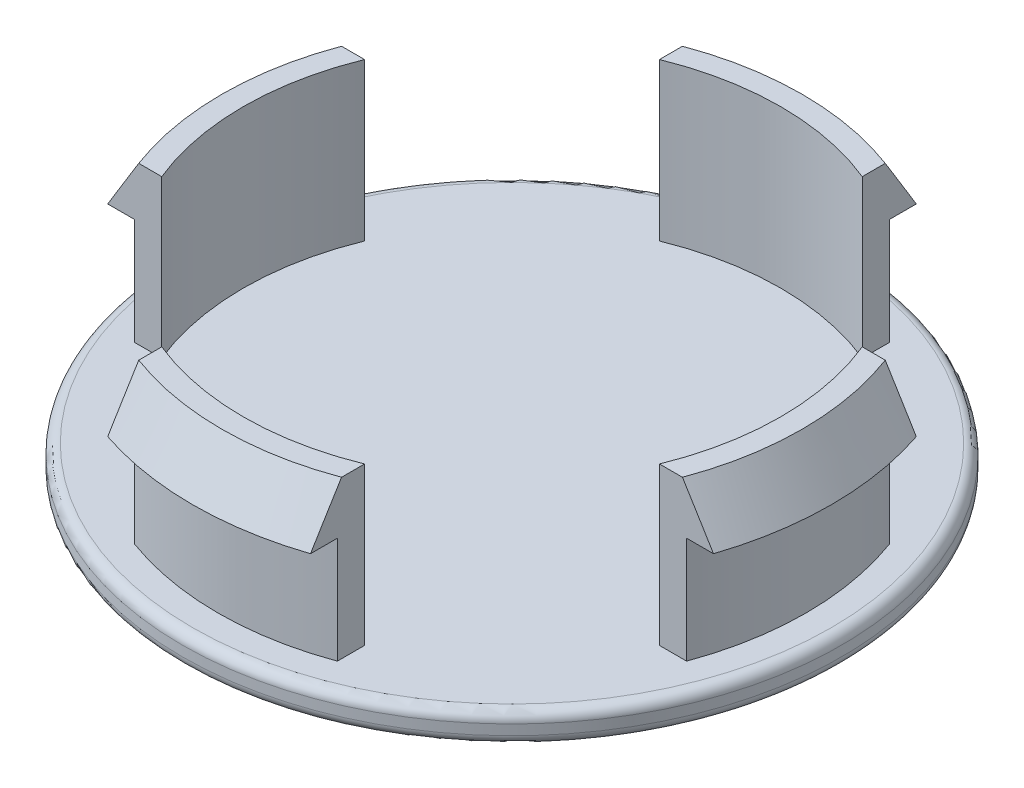
ISO-10303-21;
HEADER;
FILE_DESCRIPTION(('STEP AP214'),'2;1');
FILE_NAME('part.step','',(''),(''),'','','');
FILE_SCHEMA(('AUTOMOTIVE_DESIGN { 1 0 10303 214 1 1 1 1 }'));
ENDSEC;
DATA;
#1=APPLICATION_CONTEXT('core data for automotive mechanical design processes');
#2=APPLICATION_PROTOCOL_DEFINITION('international standard','automotive_design',2000,#1);
#3=PRODUCT_CONTEXT('',#1,'mechanical');
#4=PRODUCT('Part','Part','',(#3));
#5=PRODUCT_RELATED_PRODUCT_CATEGORY('part','',(#4));
#6=PRODUCT_DEFINITION_FORMATION('','',#4);
#7=PRODUCT_DEFINITION_CONTEXT('part definition',#1,'design');
#8=PRODUCT_DEFINITION('design','',#6,#7);
#9=PRODUCT_DEFINITION_SHAPE('','',#8);
#10=(LENGTH_UNIT() NAMED_UNIT(*) SI_UNIT(.MILLI.,.METRE.));
#11=(NAMED_UNIT(*) PLANE_ANGLE_UNIT() SI_UNIT($,.RADIAN.));
#12=(NAMED_UNIT(*) SI_UNIT($,.STERADIAN.) SOLID_ANGLE_UNIT());
#13=UNCERTAINTY_MEASURE_WITH_UNIT(LENGTH_MEASURE(1.E-05),#10,'distance_accuracy_value','');
#14=(GEOMETRIC_REPRESENTATION_CONTEXT(3) GLOBAL_UNCERTAINTY_ASSIGNED_CONTEXT((#13)) GLOBAL_UNIT_ASSIGNED_CONTEXT((#10,
#11,#12)) REPRESENTATION_CONTEXT('',''));
#15=CARTESIAN_POINT('',(0.,0.,0.));
#16=DIRECTION('',(0.,0.,1.));
#17=DIRECTION('',(1.,0.,0.));
#18=AXIS2_PLACEMENT_3D('',#15,#16,#17);
#19=CARTESIAN_POINT('',(0.,0.,0.));
#20=DIRECTION('',(0.,1.,0.));
#21=DIRECTION('',(0.,0.,1.));
#22=AXIS2_PLACEMENT_3D('',#19,#20,#21);
#23=CYLINDRICAL_SURFACE('',#22,26.5);
#24=CARTESIAN_POINT('',(0.,18.5,0.));
#25=DIRECTION('',(0.,1.,0.));
#26=DIRECTION('',(0.,0.,1.));
#27=AXIS2_PLACEMENT_3D('',#24,#25,#26);
#28=CIRCLE('',#27,26.5);
#29=CARTESIAN_POINT('',(10.,18.5,-24.5407823836161));
#30=VERTEX_POINT('',#29);
#31=CARTESIAN_POINT('',(-10.,18.5,-24.5407823836161));
#32=VERTEX_POINT('',#31);
#33=EDGE_CURVE('E216',#30,#32,#28,.T.);
#34=ORIENTED_EDGE('',*,*,#33,.T.);
#35=DIRECTION('',(0.,1.,0.));
#36=VECTOR('',#35,1.);
#37=CARTESIAN_POINT('',(-10.,-40.6378852958112,-24.5407823836161));
#38=LINE('',#37,#36);
#39=CARTESIAN_POINT('',(-10.,3.,-24.5407823836161));
#40=VERTEX_POINT('',#39);
#41=EDGE_CURVE('E210',#40,#32,#38,.T.);
#42=ORIENTED_EDGE('',*,*,#41,.F.);
#43=CARTESIAN_POINT('',(0.,3.,0.));
#44=DIRECTION('',(0.,1.,0.));
#45=DIRECTION('',(0.,0.,1.));
#46=AXIS2_PLACEMENT_3D('',#43,#44,#45);
#47=CIRCLE('',#46,26.5);
#48=CARTESIAN_POINT('',(10.,3.,-24.5407823836161));
#49=VERTEX_POINT('',#48);
#50=EDGE_CURVE('E11',#49,#40,#47,.T.);
#51=ORIENTED_EDGE('',*,*,#50,.F.);
#52=DIRECTION('',(0.,1.,0.));
#53=VECTOR('',#52,1.);
#54=CARTESIAN_POINT('',(10.,-40.6378852958112,-24.5407823836161));
#55=LINE('',#54,#53);
#56=EDGE_CURVE('E421',#49,#30,#55,.T.);
#57=ORIENTED_EDGE('',*,*,#56,.T.);
#58=EDGE_LOOP('',(#34,#42,#51,#57));
#59=FACE_BOUND('',#58,.T.);
#60=ADVANCED_FACE('F35',(#59),#23,.F.);
#61=CARTESIAN_POINT('',(-28.6132486540518,18.5,0.));
#62=DIRECTION('',(0.,1.,0.));
#63=DIRECTION('',(0.,0.,1.));
#64=AXIS2_PLACEMENT_3D('',#61,#62,#63);
#65=PLANE('',#64);
#66=CARTESIAN_POINT('',(0.,18.5,0.));
#67=DIRECTION('',(0.,1.,0.));
#68=DIRECTION('',(0.,0.,1.));
#69=AXIS2_PLACEMENT_3D('',#66,#67,#68);
#70=CIRCLE('',#69,28.6132486540518);
#71=CARTESIAN_POINT('',(10.,18.5,-26.8089163999331));
#72=VERTEX_POINT('',#71);
#73=CARTESIAN_POINT('',(-10.,18.5,-26.8089163999331));
#74=VERTEX_POINT('',#73);
#75=EDGE_CURVE('E221',#72,#74,#70,.T.);
#76=ORIENTED_EDGE('',*,*,#75,.T.);
#77=DIRECTION('',(0.,0.,1.));
#78=VECTOR('',#77,1.);
#79=CARTESIAN_POINT('',(-9.99999999999999,18.5,0.));
#80=LINE('',#79,#78);
#81=EDGE_CURVE('E202',#74,#32,#80,.T.);
#82=ORIENTED_EDGE('',*,*,#81,.T.);
#83=ORIENTED_EDGE('',*,*,#33,.F.);
#84=DIRECTION('',(0.,0.,1.));
#85=VECTOR('',#84,1.);
#86=CARTESIAN_POINT('',(9.99999999999999,18.5,0.));
#87=LINE('',#86,#85);
#88=EDGE_CURVE('E419',#72,#30,#87,.T.);
#89=ORIENTED_EDGE('',*,*,#88,.F.);
#90=EDGE_LOOP('',(#76,#82,#83,#89));
#91=FACE_BOUND('',#90,.T.);
#92=ADVANCED_FACE('F319',(#91),#65,.T.);
#93=CARTESIAN_POINT('',(0.,18.5,0.));
#94=DIRECTION('',(0.,-1.,0.));
#95=DIRECTION('',(0.,0.,-1.));
#96=AXIS2_PLACEMENT_3D('',#93,#94,#95);
#97=CONICAL_SURFACE('',#96,28.6132486540518,0.523598775598303);
#98=CARTESIAN_POINT('',(0.,13.5,0.));
#99=DIRECTION('',(0.,1.,0.));
#100=DIRECTION('',(0.,0.,1.));
#101=AXIS2_PLACEMENT_3D('',#98,#99,#100);
#102=CIRCLE('',#101,31.5);
#103=CARTESIAN_POINT('',(9.99999999999999,13.5,-29.8705540624877));
#104=VERTEX_POINT('',#103);
#105=CARTESIAN_POINT('',(-10.,13.5,-29.8705540624877));
#106=VERTEX_POINT('',#105);
#107=EDGE_CURVE('E226',#104,#106,#102,.T.);
#108=ORIENTED_EDGE('',*,*,#107,.T.);
#109=CARTESIAN_POINT('',(-10.,0.0380337176999262,-37.9777721794444));
#110=CARTESIAN_POINT('',(-10.,1.21069904858379,-37.2776349244702));
#111=CARTESIAN_POINT('',(-10.,2.38283064665295,-36.5766018971294));
#112=CARTESIAN_POINT('',(-10.,4.72577921730675,-35.1723414017115));
#113=CARTESIAN_POINT('',(-10.,5.89659618923228,-34.4691139325349));
#114=CARTESIAN_POINT('',(-10.,8.23660645610638,-33.060098917814));
#115=CARTESIAN_POINT('',(-10.,9.40579983215849,-32.3543115070117));
#116=CARTESIAN_POINT('',(-10.,11.7422864300774,-30.9395986679945));
#117=CARTESIAN_POINT('',(-10.,12.9095796530463,-30.2306732416007));
#118=CARTESIAN_POINT('',(-10.,15.2418796152031,-28.8089553369));
#119=CARTESIAN_POINT('',(-10.,16.4068862522619,-28.0961626909877));
#120=CARTESIAN_POINT('',(-10.,18.7339730871932,-26.6658236976814));
#121=CARTESIAN_POINT('',(-10.,19.8960532991588,-25.9482773732411));
#122=CARTESIAN_POINT('',(-10.,21.6364000776036,-24.8674228954663));
#123=CARTESIAN_POINT('',(-10.,22.2160690395561,-24.506372420491));
#124=CARTESIAN_POINT('',(-10.,23.3743364527512,-23.7825593471345));
#125=CARTESIAN_POINT('',(-10.,23.9529349052358,-23.4197967507415));
#126=CARTESIAN_POINT('',(-10.,25.1089173541076,-22.6923200552483));
#127=CARTESIAN_POINT('',(-10.,25.6863013307351,-22.3276059247333));
#128=CARTESIAN_POINT('',(-10.,26.8396479877336,-21.5959325867297));
#129=CARTESIAN_POINT('',(-10.,27.415610662407,-21.2289733702614));
#130=CARTESIAN_POINT('',(-10.,27.990761639856,-20.8607433765375));
#131=B_SPLINE_CURVE_WITH_KNOTS('',3,(#109,#110,#111,#112,#113,#114,#115,#116,#117,#118,#119,
#120,#121,#122,#123,#124,#125,#126,#127,#128,#129,#130),.UNSPECIFIED.,.F.,.F.,(4,2,2,2,2,2,2,2,
2,2,4),(0.,4.09732029107365,8.19464263543743,12.2917523603476,16.3888597080831,20.4861460661349,
24.5834126543644,26.6321566694296,28.6808983060587,30.7296730221881,32.7784559382096),.UNSPECIFIED.);
#132=EDGE_CURVE('E507',#106,#74,#131,.T.);
#133=ORIENTED_EDGE('',*,*,#132,.T.);
#134=ORIENTED_EDGE('',*,*,#75,.F.);
#135=CARTESIAN_POINT('',(10.,0.0380337176999262,-37.9777721794444));
#136=CARTESIAN_POINT('',(10.,1.21069904858379,-37.2776349244702));
#137=CARTESIAN_POINT('',(10.,2.38283064665295,-36.5766018971294));
#138=CARTESIAN_POINT('',(10.,4.72577921730675,-35.1723414017115));
#139=CARTESIAN_POINT('',(10.,5.89659618923228,-34.4691139325349));
#140=CARTESIAN_POINT('',(10.,8.23660645610638,-33.060098917814));
#141=CARTESIAN_POINT('',(10.,9.40579983215849,-32.3543115070117));
#142=CARTESIAN_POINT('',(10.,11.7422864300774,-30.9395986679945));
#143=CARTESIAN_POINT('',(10.,12.9095796530463,-30.2306732416007));
#144=CARTESIAN_POINT('',(10.,15.2418796152031,-28.8089553369));
#145=CARTESIAN_POINT('',(10.,16.4068862522619,-28.0961626909877));
#146=CARTESIAN_POINT('',(10.,18.7339730871932,-26.6658236976814));
#147=CARTESIAN_POINT('',(10.,19.8960532991588,-25.9482773732411));
#148=CARTESIAN_POINT('',(10.,21.6364000776036,-24.8674228954663));
#149=CARTESIAN_POINT('',(10.,22.2160690395561,-24.506372420491));
#150=CARTESIAN_POINT('',(10.,23.3743364527512,-23.7825593471345));
#151=CARTESIAN_POINT('',(10.,23.9529349052358,-23.4197967507415));
#152=CARTESIAN_POINT('',(10.,25.1089173541076,-22.6923200552483));
#153=CARTESIAN_POINT('',(10.,25.6863013307351,-22.3276059247333));
#154=CARTESIAN_POINT('',(10.,26.8396479877336,-21.5959325867297));
#155=CARTESIAN_POINT('',(10.,27.415610662407,-21.2289733702614));
#156=CARTESIAN_POINT('',(10.,27.990761639856,-20.8607433765375));
#157=B_SPLINE_CURVE_WITH_KNOTS('',3,(#135,#136,#137,#138,#139,#140,#141,#142,#143,#144,#145,
#146,#147,#148,#149,#150,#151,#152,#153,#154,#155,#156),.UNSPECIFIED.,.F.,.F.,(4,2,2,2,2,2,2,2,
2,2,4),(0.,4.09732029107365,8.19464263543743,12.2917523603476,16.3888597080831,20.4861460661349,
24.5834126543644,26.6321566694296,28.6808983060587,30.7296730221881,32.7784559382096),.UNSPECIFIED.);
#158=EDGE_CURVE('E429',#104,#72,#157,.T.);
#159=ORIENTED_EDGE('',*,*,#158,.F.);
#160=EDGE_LOOP('',(#108,#133,#134,#159));
#161=FACE_BOUND('',#160,.T.);
#162=ADVANCED_FACE('F310',(#161),#97,.T.);
#163=CARTESIAN_POINT('',(-29.,13.5,0.));
#164=DIRECTION('',(0.,-1.,0.));
#165=DIRECTION('',(0.,0.,-1.));
#166=AXIS2_PLACEMENT_3D('',#163,#164,#165);
#167=PLANE('',#166);
#168=CARTESIAN_POINT('',(0.,13.5,0.));
#169=DIRECTION('',(0.,1.,0.));
#170=DIRECTION('',(0.,0.,1.));
#171=AXIS2_PLACEMENT_3D('',#168,#169,#170);
#172=CIRCLE('',#171,29.);
#173=CARTESIAN_POINT('',(10.,13.5,-27.2213151776324));
#174=VERTEX_POINT('',#173);
#175=CARTESIAN_POINT('',(-10.,13.5,-27.2213151776324));
#176=VERTEX_POINT('',#175);
#177=EDGE_CURVE('E231',#174,#176,#172,.T.);
#178=ORIENTED_EDGE('',*,*,#177,.T.);
#179=DIRECTION('',(0.,0.,-1.));
#180=VECTOR('',#179,1.);
#181=CARTESIAN_POINT('',(-9.99999999999999,13.5,0.));
#182=LINE('',#181,#180);
#183=EDGE_CURVE('E514',#176,#106,#182,.T.);
#184=ORIENTED_EDGE('',*,*,#183,.T.);
#185=ORIENTED_EDGE('',*,*,#107,.F.);
#186=DIRECTION('',(0.,0.,-1.));
#187=VECTOR('',#186,1.);
#188=CARTESIAN_POINT('',(9.99999999999999,13.5,0.));
#189=LINE('',#188,#187);
#190=EDGE_CURVE('E427',#174,#104,#189,.T.);
#191=ORIENTED_EDGE('',*,*,#190,.F.);
#192=EDGE_LOOP('',(#178,#184,#185,#191));
#193=FACE_BOUND('',#192,.T.);
#194=ADVANCED_FACE('F303',(#193),#167,.T.);
#195=CARTESIAN_POINT('',(0.,0.,0.));
#196=DIRECTION('',(0.,1.,0.));
#197=DIRECTION('',(0.,0.,1.));
#198=AXIS2_PLACEMENT_3D('',#195,#196,#197);
#199=CYLINDRICAL_SURFACE('',#198,29.);
#200=CARTESIAN_POINT('',(0.,3.,0.));
#201=DIRECTION('',(0.,1.,0.));
#202=DIRECTION('',(0.,0.,1.));
#203=AXIS2_PLACEMENT_3D('',#200,#201,#202);
#204=CIRCLE('',#203,29.);
#205=CARTESIAN_POINT('',(10.,3.,-27.2213151776324));
#206=VERTEX_POINT('',#205);
#207=CARTESIAN_POINT('',(-10.,3.,-27.2213151776324));
#208=VERTEX_POINT('',#207);
#209=EDGE_CURVE('E236',#206,#208,#204,.T.);
#210=ORIENTED_EDGE('',*,*,#209,.T.);
#211=DIRECTION('',(0.,1.,0.));
#212=VECTOR('',#211,1.);
#213=CARTESIAN_POINT('',(-10.,0.,-27.2213151776324));
#214=LINE('',#213,#212);
#215=EDGE_CURVE('E542',#208,#176,#214,.T.);
#216=ORIENTED_EDGE('',*,*,#215,.T.);
#217=ORIENTED_EDGE('',*,*,#177,.F.);
#218=DIRECTION('',(0.,1.,0.));
#219=VECTOR('',#218,1.);
#220=CARTESIAN_POINT('',(10.,0.,-27.2213151776324));
#221=LINE('',#220,#219);
#222=EDGE_CURVE('E416',#206,#174,#221,.T.);
#223=ORIENTED_EDGE('',*,*,#222,.F.);
#224=EDGE_LOOP('',(#210,#216,#217,#223));
#225=FACE_BOUND('',#224,.T.);
#226=ADVANCED_FACE('F299',(#225),#199,.T.);
#227=DIRECTION('',(0.,1.,0.));
#228=VECTOR('',#227,1.);
#229=CARTESIAN_POINT('',(-24.5407823836161,-40.6378852958112,-9.99999999999999));
#230=LINE('',#229,#228);
#231=CARTESIAN_POINT('',(-24.5407823836161,3.,-9.99999999999999));
#232=VERTEX_POINT('',#231);
#233=CARTESIAN_POINT('',(-24.5407823836161,18.5,-9.99999999999999));
#234=VERTEX_POINT('',#233);
#235=EDGE_CURVE('E51',#232,#234,#230,.T.);
#236=ORIENTED_EDGE('',*,*,#235,.T.);
#237=CARTESIAN_POINT('',(-24.5407823836161,18.5,10.));
#238=VERTEX_POINT('',#237);
#239=EDGE_CURVE('E208',#234,#238,#28,.T.);
#240=ORIENTED_EDGE('',*,*,#239,.T.);
#241=DIRECTION('',(0.,1.,0.));
#242=VECTOR('',#241,1.);
#243=CARTESIAN_POINT('',(-24.5407823836161,-40.6378852958112,10.));
#244=LINE('',#243,#242);
#245=CARTESIAN_POINT('',(-24.5407823836161,3.,10.));
#246=VERTEX_POINT('',#245);
#247=EDGE_CURVE('E351',#246,#238,#244,.T.);
#248=ORIENTED_EDGE('',*,*,#247,.F.);
#249=EDGE_CURVE('E43',#232,#246,#47,.T.);
#250=ORIENTED_EDGE('',*,*,#249,.F.);
#251=EDGE_LOOP('',(#236,#240,#248,#250));
#252=FACE_BOUND('',#251,.T.);
#253=ADVANCED_FACE('F206',(#252),#23,.F.);
#254=DIRECTION('',(1.,0.,0.));
#255=VECTOR('',#254,1.);
#256=CARTESIAN_POINT('',(0.,18.5,-9.99999999999999));
#257=LINE('',#256,#255);
#258=CARTESIAN_POINT('',(-26.8089163999331,18.5,-9.99999999999999));
#259=VERTEX_POINT('',#258);
#260=EDGE_CURVE('E195',#259,#234,#257,.T.);
#261=ORIENTED_EDGE('',*,*,#260,.F.);
#262=CARTESIAN_POINT('',(-26.808916399933,18.5,10.));
#263=VERTEX_POINT('',#262);
#264=EDGE_CURVE('E224',#259,#263,#70,.T.);
#265=ORIENTED_EDGE('',*,*,#264,.T.);
#266=DIRECTION('',(1.,0.,0.));
#267=VECTOR('',#266,1.);
#268=CARTESIAN_POINT('',(0.,18.5,10.));
#269=LINE('',#268,#267);
#270=EDGE_CURVE('E215',#263,#238,#269,.T.);
#271=ORIENTED_EDGE('',*,*,#270,.T.);
#272=ORIENTED_EDGE('',*,*,#239,.F.);
#273=EDGE_LOOP('',(#261,#265,#271,#272));
#274=FACE_BOUND('',#273,.T.);
#275=ADVANCED_FACE('F213',(#274),#65,.T.);
#276=CARTESIAN_POINT('',(-37.9777721794444,0.0380337176999278,-9.99999999999999));
#277=CARTESIAN_POINT('',(-37.2776349244702,1.21069904858379,-9.99999999999999));
#278=CARTESIAN_POINT('',(-36.5766018971294,2.38283064665296,-9.99999999999999));
#279=CARTESIAN_POINT('',(-35.1723414017115,4.72577921730675,-9.99999999999999));
#280=CARTESIAN_POINT('',(-34.4691139325349,5.89659618923229,-9.99999999999999));
#281=CARTESIAN_POINT('',(-33.060098917814,8.23660645610639,-9.99999999999999));
#282=CARTESIAN_POINT('',(-32.3543115070117,9.4057998321585,-9.99999999999999));
#283=CARTESIAN_POINT('',(-30.9395986679945,11.7422864300774,-9.99999999999999));
#284=CARTESIAN_POINT('',(-30.2306732416007,12.9095796530463,-9.99999999999999));
#285=CARTESIAN_POINT('',(-28.8089553369,15.2418796152031,-9.99999999999999));
#286=CARTESIAN_POINT('',(-28.0961626909877,16.4068862522619,-9.99999999999999));
#287=CARTESIAN_POINT('',(-26.6658236976814,18.7339730871932,-9.99999999999999));
#288=CARTESIAN_POINT('',(-25.9482773732411,19.8960532991588,-9.99999999999999));
#289=CARTESIAN_POINT('',(-24.8674228954663,21.6364000776036,-9.99999999999999));
#290=CARTESIAN_POINT('',(-24.506372420491,22.2160690395561,-9.99999999999999));
#291=CARTESIAN_POINT('',(-23.7825593471346,23.3743364527512,-9.99999999999999));
#292=CARTESIAN_POINT('',(-23.4197967507415,23.9529349052358,-9.99999999999999));
#293=CARTESIAN_POINT('',(-22.6923200552483,25.1089173541076,-9.99999999999999));
#294=CARTESIAN_POINT('',(-22.3276059247333,25.6863013307351,-9.99999999999999));
#295=CARTESIAN_POINT('',(-21.5959325867297,26.8396479877337,-9.99999999999999));
#296=CARTESIAN_POINT('',(-21.2289733702614,27.415610662407,-9.99999999999999));
#297=CARTESIAN_POINT('',(-20.8607433765375,27.990761639856,-9.99999999999999));
#298=B_SPLINE_CURVE_WITH_KNOTS('',3,(#276,#277,#278,#279,#280,#281,#282,#283,#284,#285,#286,
#287,#288,#289,#290,#291,#292,#293,#294,#295,#296,#297),.UNSPECIFIED.,.F.,.F.,(4,2,2,2,2,2,2,2,
2,2,4),(0.,4.09732029107365,8.19464263543744,12.2917523603476,16.3888597080831,20.4861460661349,
24.5834126543644,26.6321566694296,28.6808983060587,30.7296730221881,32.7784559382096),.UNSPECIFIED.);
#299=CARTESIAN_POINT('',(-29.8705540624877,13.5,-9.99999999999999));
#300=VERTEX_POINT('',#299);
#301=EDGE_CURVE('E198',#300,#259,#298,.T.);
#302=ORIENTED_EDGE('',*,*,#301,.F.);
#303=CARTESIAN_POINT('',(-29.8705540624877,13.5,10.));
#304=VERTEX_POINT('',#303);
#305=EDGE_CURVE('E229',#300,#304,#102,.T.);
#306=ORIENTED_EDGE('',*,*,#305,.T.);
#307=CARTESIAN_POINT('',(-37.9777721794444,0.0380337176999172,10.));
#308=CARTESIAN_POINT('',(-37.2776349244702,1.21069904858378,10.));
#309=CARTESIAN_POINT('',(-36.5766018971294,2.38283064665295,10.));
#310=CARTESIAN_POINT('',(-35.1723414017115,4.72577921730674,10.));
#311=CARTESIAN_POINT('',(-34.4691139325349,5.89659618923228,10.));
#312=CARTESIAN_POINT('',(-33.060098917814,8.23660645610638,10.));
#313=CARTESIAN_POINT('',(-32.3543115070117,9.40579983215848,10.));
#314=CARTESIAN_POINT('',(-30.9395986679945,11.7422864300774,10.));
#315=CARTESIAN_POINT('',(-30.2306732416007,12.9095796530463,10.));
#316=CARTESIAN_POINT('',(-28.8089553369,15.2418796152031,10.));
#317=CARTESIAN_POINT('',(-28.0961626909877,16.4068862522619,10.));
#318=CARTESIAN_POINT('',(-26.6658236976814,18.7339730871932,10.));
#319=CARTESIAN_POINT('',(-25.9482773732411,19.8960532991588,10.));
#320=CARTESIAN_POINT('',(-24.8674228954663,21.6364000776036,10.));
#321=CARTESIAN_POINT('',(-24.506372420491,22.2160690395561,10.));
#322=CARTESIAN_POINT('',(-23.7825593471345,23.3743364527512,10.));
#323=CARTESIAN_POINT('',(-23.4197967507415,23.9529349052358,10.));
#324=CARTESIAN_POINT('',(-22.6923200552483,25.1089173541076,10.));
#325=CARTESIAN_POINT('',(-22.3276059247332,25.6863013307351,10.));
#326=CARTESIAN_POINT('',(-21.5959325867297,26.8396479877337,10.));
#327=CARTESIAN_POINT('',(-21.2289733702614,27.415610662407,10.));
#328=CARTESIAN_POINT('',(-20.8607433765375,27.990761639856,10.));
#329=B_SPLINE_CURVE_WITH_KNOTS('',3,(#307,#308,#309,#310,#311,#312,#313,#314,#315,#316,#317,
#318,#319,#320,#321,#322,#323,#324,#325,#326,#327,#328),.UNSPECIFIED.,.F.,.F.,(4,2,2,2,2,2,2,2,
2,2,4),(0.,4.09732029107365,8.19464263543744,12.2917523603476,16.3888597080831,20.4861460661349,
24.5834126543644,26.6321566694296,28.6808983060587,30.7296730221881,32.7784559382096),.UNSPECIFIED.);
#330=EDGE_CURVE('E364',#304,#263,#329,.T.);
#331=ORIENTED_EDGE('',*,*,#330,.T.);
#332=ORIENTED_EDGE('',*,*,#264,.F.);
#333=EDGE_LOOP('',(#302,#306,#331,#332));
#334=FACE_BOUND('',#333,.T.);
#335=ADVANCED_FACE('F452',(#334),#97,.T.);
#336=DIRECTION('',(-1.,0.,0.));
#337=VECTOR('',#336,1.);
#338=CARTESIAN_POINT('',(-29.,13.5,-9.99999999999999));
#339=LINE('',#338,#337);
#340=CARTESIAN_POINT('',(-27.2213151776324,13.5,-9.99999999999999));
#341=VERTEX_POINT('',#340);
#342=EDGE_CURVE('E531',#341,#300,#339,.T.);
#343=ORIENTED_EDGE('',*,*,#342,.F.);
#344=CARTESIAN_POINT('',(-27.2213151776324,13.5,10.));
#345=VERTEX_POINT('',#344);
#346=EDGE_CURVE('E234',#341,#345,#172,.T.);
#347=ORIENTED_EDGE('',*,*,#346,.T.);
#348=DIRECTION('',(-1.,0.,0.));
#349=VECTOR('',#348,1.);
#350=CARTESIAN_POINT('',(-29.,13.5,10.));
#351=LINE('',#350,#349);
#352=EDGE_CURVE('E369',#345,#304,#351,.T.);
#353=ORIENTED_EDGE('',*,*,#352,.T.);
#354=ORIENTED_EDGE('',*,*,#305,.F.);
#355=EDGE_LOOP('',(#343,#347,#353,#354));
#356=FACE_BOUND('',#355,.T.);
#357=ADVANCED_FACE('F315',(#356),#167,.T.);
#358=DIRECTION('',(0.,1.,0.));
#359=VECTOR('',#358,1.);
#360=CARTESIAN_POINT('',(-27.2213151776324,0.,-9.99999999999999));
#361=LINE('',#360,#359);
#362=CARTESIAN_POINT('',(-27.2213151776324,3.,-9.99999999999999));
#363=VERTEX_POINT('',#362);
#364=EDGE_CURVE('E530',#363,#341,#361,.T.);
#365=ORIENTED_EDGE('',*,*,#364,.F.);
#366=CARTESIAN_POINT('',(-27.2213151776324,3.,10.));
#367=VERTEX_POINT('',#366);
#368=EDGE_CURVE('E239',#363,#367,#204,.T.);
#369=ORIENTED_EDGE('',*,*,#368,.T.);
#370=DIRECTION('',(0.,1.,0.));
#371=VECTOR('',#370,1.);
#372=CARTESIAN_POINT('',(-27.2213151776324,0.,10.));
#373=LINE('',#372,#371);
#374=EDGE_CURVE('E461',#367,#345,#373,.T.);
#375=ORIENTED_EDGE('',*,*,#374,.T.);
#376=ORIENTED_EDGE('',*,*,#346,.F.);
#377=EDGE_LOOP('',(#365,#369,#375,#376));
#378=FACE_BOUND('',#377,.T.);
#379=ADVANCED_FACE('F336',(#378),#199,.T.);
#380=DIRECTION('',(0.,1.,0.));
#381=VECTOR('',#380,1.);
#382=CARTESIAN_POINT('',(-9.99999999999999,-40.6378852958112,24.5407823836161));
#383=LINE('',#382,#381);
#384=CARTESIAN_POINT('',(-9.99999999999999,3.,24.5407823836161));
#385=VERTEX_POINT('',#384);
#386=CARTESIAN_POINT('',(-9.99999999999999,18.5,24.5407823836161));
#387=VERTEX_POINT('',#386);
#388=EDGE_CURVE('E59',#385,#387,#383,.T.);
#389=ORIENTED_EDGE('',*,*,#388,.T.);
#390=CARTESIAN_POINT('',(10.,18.5,24.5407823836161));
#391=VERTEX_POINT('',#390);
#392=EDGE_CURVE('E217',#387,#391,#28,.T.);
#393=ORIENTED_EDGE('',*,*,#392,.T.);
#394=DIRECTION('',(0.,1.,0.));
#395=VECTOR('',#394,1.);
#396=CARTESIAN_POINT('',(10.,-40.6378852958112,24.5407823836161));
#397=LINE('',#396,#395);
#398=CARTESIAN_POINT('',(10.,3.,24.5407823836161));
#399=VERTEX_POINT('',#398);
#400=EDGE_CURVE('E375',#399,#391,#397,.T.);
#401=ORIENTED_EDGE('',*,*,#400,.F.);
#402=EDGE_CURVE('E350',#385,#399,#47,.T.);
#403=ORIENTED_EDGE('',*,*,#402,.F.);
#404=EDGE_LOOP('',(#389,#393,#401,#403));
#405=FACE_BOUND('',#404,.T.);
#406=ADVANCED_FACE('F326',(#405),#23,.F.);
#407=DIRECTION('',(0.,0.,-1.));
#408=VECTOR('',#407,1.);
#409=CARTESIAN_POINT('',(-9.99999999999999,18.5,0.));
#410=LINE('',#409,#408);
#411=CARTESIAN_POINT('',(-9.99999999999999,18.5,26.8089163999331));
#412=VERTEX_POINT('',#411);
#413=EDGE_CURVE('E352',#412,#387,#410,.T.);
#414=ORIENTED_EDGE('',*,*,#413,.F.);
#415=CARTESIAN_POINT('',(10.,18.5,26.808916399933));
#416=VERTEX_POINT('',#415);
#417=EDGE_CURVE('E359',#412,#416,#70,.T.);
#418=ORIENTED_EDGE('',*,*,#417,.T.);
#419=DIRECTION('',(0.,0.,-1.));
#420=VECTOR('',#419,1.);
#421=CARTESIAN_POINT('',(9.99999999999999,18.5,0.));
#422=LINE('',#421,#420);
#423=EDGE_CURVE('E358',#416,#391,#422,.T.);
#424=ORIENTED_EDGE('',*,*,#423,.T.);
#425=ORIENTED_EDGE('',*,*,#392,.F.);
#426=EDGE_LOOP('',(#414,#418,#424,#425));
#427=FACE_BOUND('',#426,.T.);
#428=ADVANCED_FACE('F334',(#427),#65,.T.);
#429=CARTESIAN_POINT('',(-9.99999999999999,3.42368081403602,35.9527565270953));
#430=CARTESIAN_POINT('',(-9.99999999999999,4.59521408140025,35.2506665958291));
#431=CARTESIAN_POINT('',(-9.99999999999999,5.7661214915212,34.5475296177078));
#432=CARTESIAN_POINT('',(-9.99999999999999,8.10636962080832,33.138653236848));
#433=CARTESIAN_POINT('',(-9.99999999999999,9.27571033969964,32.432913833653));
#434=CARTESIAN_POINT('',(-9.99999999999999,11.6124148695572,31.0183819229133));
#435=CARTESIAN_POINT('',(-9.99999999999999,12.7797788332699,30.3095896678125));
#436=CARTESIAN_POINT('',(-9.99999999999999,15.1121868835016,28.8881986647334));
#437=CARTESIAN_POINT('',(-9.99999999999999,16.277230972117,28.1755999201968));
#438=CARTESIAN_POINT('',(-9.99999999999999,18.6045059755668,26.7456288315779));
#439=CARTESIAN_POINT('',(-9.99999999999999,19.7667366761367,26.0282561386048));
#440=CARTESIAN_POINT('',(-9.99999999999999,22.0874980472544,24.5875643264923));
#441=CARTESIAN_POINT('',(-9.99999999999999,23.2460287498104,23.8642452589883));
#442=CARTESIAN_POINT('',(-9.99999999999999,24.9802472257181,22.7734696602662));
#443=CARTESIAN_POINT('',(-9.99999999999999,25.557748454188,22.4088958835578));
#444=CARTESIAN_POINT('',(-9.99999999999999,26.7113466818007,21.6775352593463));
#445=CARTESIAN_POINT('',(-9.99999999999999,27.2874436840362,21.3107484167237));
#446=CARTESIAN_POINT('',(-9.99999999999999,28.438026870799,20.5746184596295));
#447=CARTESIAN_POINT('',(-9.99999999999999,29.0125130082962,20.2052752715938));
#448=CARTESIAN_POINT('',(-9.99999999999999,30.1595616759573,19.4636051819272));
#449=CARTESIAN_POINT('',(-9.99999999999999,30.7321241914783,19.0912782576563));
#450=CARTESIAN_POINT('',(-9.99999999999999,31.303572493779,18.7172433001158));
#451=B_SPLINE_CURVE_WITH_KNOTS('',3,(#429,#430,#431,#432,#433,#434,#435,#436,#437,#438,#439,
#440,#441,#442,#443,#444,#445,#446,#447,#448,#449,#450),.UNSPECIFIED.,.F.,.F.,(4,2,2,2,2,2,2,2,
2,2,4),(0.,4.09741344256984,8.19482760389689,12.2919092122575,16.3889871166004,20.4863678066193,
24.5837129543752,26.6325610999287,28.6814047287601,30.7303075644891,32.7792259616017),.UNSPECIFIED.);
#452=CARTESIAN_POINT('',(-9.99999999999999,13.5,29.8705540624877));
#453=VERTEX_POINT('',#452);
#454=EDGE_CURVE('E463',#453,#412,#451,.T.);
#455=ORIENTED_EDGE('',*,*,#454,.F.);
#456=CARTESIAN_POINT('',(10.,13.5,29.8705540624877));
#457=VERTEX_POINT('',#456);
#458=EDGE_CURVE('E445',#453,#457,#102,.T.);
#459=ORIENTED_EDGE('',*,*,#458,.T.);
#460=CARTESIAN_POINT('',(10.,3.42368081403601,35.9527565270954));
#461=CARTESIAN_POINT('',(10.,4.59521408140023,35.2506665958291));
#462=CARTESIAN_POINT('',(10.,5.76612149152118,34.5475296177078));
#463=CARTESIAN_POINT('',(10.,8.10636962080831,33.138653236848));
#464=CARTESIAN_POINT('',(10.,9.27571033969963,32.432913833653));
#465=CARTESIAN_POINT('',(10.,11.6124148695572,31.0183819229133));
#466=CARTESIAN_POINT('',(10.,12.7797788332699,30.3095896678125));
#467=CARTESIAN_POINT('',(10.,15.1121868835016,28.8881986647334));
#468=CARTESIAN_POINT('',(10.,16.277230972117,28.1755999201968));
#469=CARTESIAN_POINT('',(10.,18.6045059755668,26.7456288315779));
#470=CARTESIAN_POINT('',(10.,19.7667366761367,26.0282561386048));
#471=CARTESIAN_POINT('',(10.,22.0874980472544,24.5875643264923));
#472=CARTESIAN_POINT('',(10.,23.2460287498104,23.8642452589883));
#473=CARTESIAN_POINT('',(10.,24.9802472257181,22.7734696602662));
#474=CARTESIAN_POINT('',(10.,25.557748454188,22.4088958835578));
#475=CARTESIAN_POINT('',(10.,26.7113466818007,21.6775352593463));
#476=CARTESIAN_POINT('',(10.,27.2874436840362,21.3107484167237));
#477=CARTESIAN_POINT('',(10.,28.438026870799,20.5746184596295));
#478=CARTESIAN_POINT('',(10.,29.0125130082962,20.2052752715938));
#479=CARTESIAN_POINT('',(10.,30.1595616759573,19.4636051819272));
#480=CARTESIAN_POINT('',(10.,30.7321241914783,19.0912782576563));
#481=CARTESIAN_POINT('',(10.,31.303572493779,18.7172433001158));
#482=B_SPLINE_CURVE_WITH_KNOTS('',3,(#460,#461,#462,#463,#464,#465,#466,#467,#468,#469,#470,
#471,#472,#473,#474,#475,#476,#477,#478,#479,#480,#481),.UNSPECIFIED.,.F.,.F.,(4,2,2,2,2,2,2,2,
2,2,4),(0.,4.09741344256984,8.1948276038969,12.2919092122575,16.3889871166004,20.4863678066193,
24.5837129543753,26.6325610999287,28.6814047287601,30.7303075644891,32.7792259616017),.UNSPECIFIED.);
#483=EDGE_CURVE('E403',#457,#416,#482,.T.);
#484=ORIENTED_EDGE('',*,*,#483,.T.);
#485=ORIENTED_EDGE('',*,*,#417,.F.);
#486=EDGE_LOOP('',(#455,#459,#484,#485));
#487=FACE_BOUND('',#486,.T.);
#488=ADVANCED_FACE('F311',(#487),#97,.T.);
#489=DIRECTION('',(0.,0.,1.));
#490=VECTOR('',#489,1.);
#491=CARTESIAN_POINT('',(-9.99999999999999,13.5,0.));
#492=LINE('',#491,#490);
#493=CARTESIAN_POINT('',(-9.99999999999999,13.5,27.2213151776324));
#494=VERTEX_POINT('',#493);
#495=EDGE_CURVE('E483',#494,#453,#492,.T.);
#496=ORIENTED_EDGE('',*,*,#495,.F.);
#497=CARTESIAN_POINT('',(10.,13.5,27.2213151776324));
#498=VERTEX_POINT('',#497);
#499=EDGE_CURVE('E482',#494,#498,#172,.T.);
#500=ORIENTED_EDGE('',*,*,#499,.T.);
#501=DIRECTION('',(0.,0.,1.));
#502=VECTOR('',#501,1.);
#503=CARTESIAN_POINT('',(9.99999999999999,13.5,0.));
#504=LINE('',#503,#502);
#505=EDGE_CURVE('E409',#498,#457,#504,.T.);
#506=ORIENTED_EDGE('',*,*,#505,.T.);
#507=ORIENTED_EDGE('',*,*,#458,.F.);
#508=EDGE_LOOP('',(#496,#500,#506,#507));
#509=FACE_BOUND('',#508,.T.);
#510=ADVANCED_FACE('F304',(#509),#167,.T.);
#511=DIRECTION('',(0.,1.,0.));
#512=VECTOR('',#511,1.);
#513=CARTESIAN_POINT('',(-9.99999999999999,0.,27.2213151776324));
#514=LINE('',#513,#512);
#515=CARTESIAN_POINT('',(-9.99999999999999,3.,27.2213151776324));
#516=VERTEX_POINT('',#515);
#517=EDGE_CURVE('E485',#516,#494,#514,.T.);
#518=ORIENTED_EDGE('',*,*,#517,.F.);
#519=CARTESIAN_POINT('',(10.,3.,27.2213151776324));
#520=VERTEX_POINT('',#519);
#521=EDGE_CURVE('E475',#516,#520,#204,.T.);
#522=ORIENTED_EDGE('',*,*,#521,.T.);
#523=DIRECTION('',(0.,1.,0.));
#524=VECTOR('',#523,1.);
#525=CARTESIAN_POINT('',(10.,0.,27.2213151776324));
#526=LINE('',#525,#524);
#527=EDGE_CURVE('E389',#520,#498,#526,.T.);
#528=ORIENTED_EDGE('',*,*,#527,.T.);
#529=ORIENTED_EDGE('',*,*,#499,.F.);
#530=EDGE_LOOP('',(#518,#522,#528,#529));
#531=FACE_BOUND('',#530,.T.);
#532=ADVANCED_FACE('F300',(#531),#199,.T.);
#533=DIRECTION('',(0.,1.,0.));
#534=VECTOR('',#533,1.);
#535=CARTESIAN_POINT('',(24.5407823836161,-40.6378852958112,10.));
#536=LINE('',#535,#534);
#537=CARTESIAN_POINT('',(24.5407823836161,3.,10.));
#538=VERTEX_POINT('',#537);
#539=CARTESIAN_POINT('',(24.5407823836161,18.5,10.));
#540=VERTEX_POINT('',#539);
#541=EDGE_CURVE('E366',#538,#540,#536,.T.);
#542=ORIENTED_EDGE('',*,*,#541,.T.);
#543=CARTESIAN_POINT('',(24.5407823836161,18.5,-10.));
#544=VERTEX_POINT('',#543);
#545=EDGE_CURVE('E219',#540,#544,#28,.T.);
#546=ORIENTED_EDGE('',*,*,#545,.T.);
#547=DIRECTION('',(0.,1.,0.));
#548=VECTOR('',#547,1.);
#549=CARTESIAN_POINT('',(24.5407823836161,-40.6378852958112,-10.));
#550=LINE('',#549,#548);
#551=CARTESIAN_POINT('',(24.5407823836161,3.,-10.));
#552=VERTEX_POINT('',#551);
#553=EDGE_CURVE('E413',#552,#544,#550,.T.);
#554=ORIENTED_EDGE('',*,*,#553,.F.);
#555=EDGE_CURVE('E44',#538,#552,#47,.T.);
#556=ORIENTED_EDGE('',*,*,#555,.F.);
#557=EDGE_LOOP('',(#542,#546,#554,#556));
#558=FACE_BOUND('',#557,.T.);
#559=ADVANCED_FACE('F37',(#558),#23,.F.);
#560=DIRECTION('',(-1.,0.,0.));
#561=VECTOR('',#560,1.);
#562=CARTESIAN_POINT('',(0.,18.5,9.99999999999999));
#563=LINE('',#562,#561);
#564=CARTESIAN_POINT('',(26.8089163999331,18.5,10.));
#565=VERTEX_POINT('',#564);
#566=EDGE_CURVE('E363',#565,#540,#563,.T.);
#567=ORIENTED_EDGE('',*,*,#566,.F.);
#568=CARTESIAN_POINT('',(26.8089163999331,18.5,-10.));
#569=VERTEX_POINT('',#568);
#570=EDGE_CURVE('E225',#565,#569,#70,.T.);
#571=ORIENTED_EDGE('',*,*,#570,.T.);
#572=DIRECTION('',(-1.,0.,0.));
#573=VECTOR('',#572,1.);
#574=CARTESIAN_POINT('',(0.,18.5,-10.));
#575=LINE('',#574,#573);
#576=EDGE_CURVE('E408',#569,#544,#575,.T.);
#577=ORIENTED_EDGE('',*,*,#576,.T.);
#578=ORIENTED_EDGE('',*,*,#545,.F.);
#579=EDGE_LOOP('',(#567,#571,#577,#578));
#580=FACE_BOUND('',#579,.T.);
#581=ADVANCED_FACE('F308',(#580),#65,.T.);
#582=CARTESIAN_POINT('',(35.9527565270954,3.42368081403601,10.));
#583=CARTESIAN_POINT('',(35.2506665958291,4.59521408140024,10.));
#584=CARTESIAN_POINT('',(34.5475296177078,5.76612149152119,10.));
#585=CARTESIAN_POINT('',(33.138653236848,8.10636962080832,10.));
#586=CARTESIAN_POINT('',(32.432913833653,9.27571033969964,10.));
#587=CARTESIAN_POINT('',(31.0183819229133,11.6124148695572,10.));
#588=CARTESIAN_POINT('',(30.3095896678125,12.7797788332699,10.));
#589=CARTESIAN_POINT('',(28.8881986647334,15.1121868835016,10.));
#590=CARTESIAN_POINT('',(28.1755999201968,16.277230972117,10.));
#591=CARTESIAN_POINT('',(26.7456288315779,18.6045059755668,10.));
#592=CARTESIAN_POINT('',(26.0282561386049,19.7667366761367,10.));
#593=CARTESIAN_POINT('',(24.5875643264923,22.0874980472544,10.));
#594=CARTESIAN_POINT('',(23.8642452589883,23.2460287498104,10.));
#595=CARTESIAN_POINT('',(22.7734696602662,24.9802472257181,10.));
#596=CARTESIAN_POINT('',(22.4088958835579,25.557748454188,10.));
#597=CARTESIAN_POINT('',(21.6775352593463,26.7113466818007,10.));
#598=CARTESIAN_POINT('',(21.3107484167237,27.2874436840362,10.));
#599=CARTESIAN_POINT('',(20.5746184596295,28.438026870799,10.));
#600=CARTESIAN_POINT('',(20.2052752715938,29.0125130082962,9.99999999999999));
#601=CARTESIAN_POINT('',(19.4636051819272,30.1595616759573,9.99999999999999));
#602=CARTESIAN_POINT('',(19.0912782576563,30.7321241914783,9.99999999999999));
#603=CARTESIAN_POINT('',(18.7172433001158,31.303572493779,9.99999999999999));
#604=B_SPLINE_CURVE_WITH_KNOTS('',3,(#582,#583,#584,#585,#586,#587,#588,#589,#590,#591,#592,
#593,#594,#595,#596,#597,#598,#599,#600,#601,#602,#603),.UNSPECIFIED.,.F.,.F.,(4,2,2,2,2,2,2,2,
2,2,4),(0.,4.09741344256984,8.1948276038969,12.2919092122575,16.3889871166004,20.4863678066193,
24.5837129543753,26.6325610999287,28.6814047287601,30.7303075644891,32.7792259616017),.UNSPECIFIED.);
#605=CARTESIAN_POINT('',(29.8705540624877,13.5,10.));
#606=VERTEX_POINT('',#605);
#607=EDGE_CURVE('E383',#606,#565,#604,.T.);
#608=ORIENTED_EDGE('',*,*,#607,.F.);
#609=CARTESIAN_POINT('',(29.8705540624877,13.5,-10.));
#610=VERTEX_POINT('',#609);
#611=EDGE_CURVE('E230',#606,#610,#102,.T.);
#612=ORIENTED_EDGE('',*,*,#611,.T.);
#613=CARTESIAN_POINT('',(35.9527565270954,3.42368081403601,-10.));
#614=CARTESIAN_POINT('',(35.2506665958291,4.59521408140024,-10.));
#615=CARTESIAN_POINT('',(34.5475296177078,5.76612149152119,-10.));
#616=CARTESIAN_POINT('',(33.138653236848,8.10636962080831,-10.));
#617=CARTESIAN_POINT('',(32.432913833653,9.27571033969963,-10.));
#618=CARTESIAN_POINT('',(31.0183819229133,11.6124148695572,-10.));
#619=CARTESIAN_POINT('',(30.3095896678125,12.7797788332699,-10.));
#620=CARTESIAN_POINT('',(28.8881986647334,15.1121868835016,-10.));
#621=CARTESIAN_POINT('',(28.1755999201968,16.277230972117,-10.));
#622=CARTESIAN_POINT('',(26.7456288315779,18.6045059755668,-10.));
#623=CARTESIAN_POINT('',(26.0282561386049,19.7667366761367,-10.));
#624=CARTESIAN_POINT('',(24.5875643264923,22.0874980472544,-10.));
#625=CARTESIAN_POINT('',(23.8642452589883,23.2460287498104,-10.));
#626=CARTESIAN_POINT('',(22.7734696602662,24.980247225718,-10.));
#627=CARTESIAN_POINT('',(22.4088958835578,25.557748454188,-10.));
#628=CARTESIAN_POINT('',(21.6775352593463,26.7113466818007,-10.));
#629=CARTESIAN_POINT('',(21.3107484167237,27.2874436840362,-10.));
#630=CARTESIAN_POINT('',(20.5746184596295,28.438026870799,-10.));
#631=CARTESIAN_POINT('',(20.2052752715938,29.0125130082962,-10.));
#632=CARTESIAN_POINT('',(19.4636051819272,30.1595616759573,-10.));
#633=CARTESIAN_POINT('',(19.0912782576563,30.7321241914783,-10.));
#634=CARTESIAN_POINT('',(18.7172433001158,31.303572493779,-10.));
#635=B_SPLINE_CURVE_WITH_KNOTS('',3,(#613,#614,#615,#616,#617,#618,#619,#620,#621,#622,#623,
#624,#625,#626,#627,#628,#629,#630,#631,#632,#633,#634),.UNSPECIFIED.,.F.,.F.,(4,2,2,2,2,2,2,2,
2,2,4),(0.,4.09741344256984,8.19482760389689,12.2919092122575,16.3889871166004,20.4863678066193,
24.5837129543752,26.6325610999287,28.6814047287601,30.7303075644891,32.7792259616017),.UNSPECIFIED.);
#636=EDGE_CURVE('E253',#610,#569,#635,.T.);
#637=ORIENTED_EDGE('',*,*,#636,.T.);
#638=ORIENTED_EDGE('',*,*,#570,.F.);
#639=EDGE_LOOP('',(#608,#612,#637,#638));
#640=FACE_BOUND('',#639,.T.);
#641=ADVANCED_FACE('F263',(#640),#97,.T.);
#642=DIRECTION('',(1.,0.,0.));
#643=VECTOR('',#642,1.);
#644=CARTESIAN_POINT('',(-29.,13.5,9.99999999999999));
#645=LINE('',#644,#643);
#646=CARTESIAN_POINT('',(27.2213151776324,13.5,10.));
#647=VERTEX_POINT('',#646);
#648=EDGE_CURVE('E381',#647,#606,#645,.T.);
#649=ORIENTED_EDGE('',*,*,#648,.F.);
#650=CARTESIAN_POINT('',(27.2213151776324,13.5,-10.));
#651=VERTEX_POINT('',#650);
#652=EDGE_CURVE('E235',#647,#651,#172,.T.);
#653=ORIENTED_EDGE('',*,*,#652,.T.);
#654=DIRECTION('',(1.,0.,0.));
#655=VECTOR('',#654,1.);
#656=CARTESIAN_POINT('',(-29.,13.5,-9.99999999999999));
#657=LINE('',#656,#655);
#658=EDGE_CURVE('E261',#651,#610,#657,.T.);
#659=ORIENTED_EDGE('',*,*,#658,.T.);
#660=ORIENTED_EDGE('',*,*,#611,.F.);
#661=EDGE_LOOP('',(#649,#653,#659,#660));
#662=FACE_BOUND('',#661,.T.);
#663=ADVANCED_FACE('F297',(#662),#167,.T.);
#664=DIRECTION('',(0.,1.,0.));
#665=VECTOR('',#664,1.);
#666=CARTESIAN_POINT('',(27.2213151776324,0.,10.));
#667=LINE('',#666,#665);
#668=CARTESIAN_POINT('',(27.2213151776324,3.,10.));
#669=VERTEX_POINT('',#668);
#670=EDGE_CURVE('E379',#669,#647,#667,.T.);
#671=ORIENTED_EDGE('',*,*,#670,.F.);
#672=CARTESIAN_POINT('',(27.2213151776324,3.,-10.));
#673=VERTEX_POINT('',#672);
#674=EDGE_CURVE('E240',#669,#673,#204,.T.);
#675=ORIENTED_EDGE('',*,*,#674,.T.);
#676=DIRECTION('',(0.,1.,0.));
#677=VECTOR('',#676,1.);
#678=CARTESIAN_POINT('',(27.2213151776324,0.,-10.));
#679=LINE('',#678,#677);
#680=EDGE_CURVE('E433',#673,#651,#679,.T.);
#681=ORIENTED_EDGE('',*,*,#680,.T.);
#682=ORIENTED_EDGE('',*,*,#652,.F.);
#683=EDGE_LOOP('',(#671,#675,#681,#682));
#684=FACE_BOUND('',#683,.T.);
#685=ADVANCED_FACE('F294',(#684),#199,.T.);
#686=CARTESIAN_POINT('',(-31.5,3.,0.));
#687=DIRECTION('',(0.,1.,0.));
#688=DIRECTION('',(0.,0.,1.));
#689=AXIS2_PLACEMENT_3D('',#686,#687,#688);
#690=PLANE('',#689);
#691=DIRECTION('',(0.,0.,-1.));
#692=VECTOR('',#691,1.);
#693=CARTESIAN_POINT('',(-9.99999999999999,3.,0.));
#694=LINE('',#693,#692);
#695=EDGE_CURVE('E532',#40,#208,#694,.T.);
#696=ORIENTED_EDGE('',*,*,#695,.T.);
#697=ORIENTED_EDGE('',*,*,#209,.F.);
#698=DIRECTION('',(0.,0.,-1.));
#699=VECTOR('',#698,1.);
#700=CARTESIAN_POINT('',(9.99999999999999,3.,0.));
#701=LINE('',#700,#699);
#702=EDGE_CURVE('E410',#49,#206,#701,.T.);
#703=ORIENTED_EDGE('',*,*,#702,.F.);
#704=ORIENTED_EDGE('',*,*,#50,.T.);
#705=EDGE_LOOP('',(#696,#697,#703,#704));
#706=FACE_BOUND('',#705,.T.);
#707=ORIENTED_EDGE('',*,*,#368,.F.);
#708=DIRECTION('',(-1.,0.,0.));
#709=VECTOR('',#708,1.);
#710=CARTESIAN_POINT('',(0.,3.,-9.99999999999999));
#711=LINE('',#710,#709);
#712=EDGE_CURVE('E522',#232,#363,#711,.T.);
#713=ORIENTED_EDGE('',*,*,#712,.F.);
#714=ORIENTED_EDGE('',*,*,#249,.T.);
#715=DIRECTION('',(-1.,0.,0.));
#716=VECTOR('',#715,1.);
#717=CARTESIAN_POINT('',(0.,3.,10.));
#718=LINE('',#717,#716);
#719=EDGE_CURVE('E486',#246,#367,#718,.T.);
#720=ORIENTED_EDGE('',*,*,#719,.T.);
#721=EDGE_LOOP('',(#707,#713,#714,#720));
#722=FACE_BOUND('',#721,.T.);
#723=CARTESIAN_POINT('',(0.,3.,0.));
#724=DIRECTION('',(0.,1.,0.));
#725=DIRECTION('',(0.,0.,1.));
#726=AXIS2_PLACEMENT_3D('',#723,#724,#725);
#727=CIRCLE('',#726,31.5);
#728=CARTESIAN_POINT('',(0.,3.,31.5));
#729=VERTEX_POINT('',#728);
#730=EDGE_CURVE('E241',#729,#729,#727,.T.);
#731=ORIENTED_EDGE('',*,*,#730,.T.);
#732=EDGE_LOOP('',(#731));
#733=FACE_BOUND('',#732,.T.);
#734=ORIENTED_EDGE('',*,*,#674,.F.);
#735=DIRECTION('',(1.,0.,0.));
#736=VECTOR('',#735,1.);
#737=CARTESIAN_POINT('',(0.,3.,9.99999999999999));
#738=LINE('',#737,#736);
#739=EDGE_CURVE('E377',#538,#669,#738,.T.);
#740=ORIENTED_EDGE('',*,*,#739,.F.);
#741=ORIENTED_EDGE('',*,*,#555,.T.);
#742=DIRECTION('',(1.,0.,0.));
#743=VECTOR('',#742,1.);
#744=CARTESIAN_POINT('',(0.,3.,-10.));
#745=LINE('',#744,#743);
#746=EDGE_CURVE('E412',#552,#673,#745,.T.);
#747=ORIENTED_EDGE('',*,*,#746,.T.);
#748=EDGE_LOOP('',(#734,#740,#741,#747));
#749=FACE_BOUND('',#748,.T.);
#750=ORIENTED_EDGE('',*,*,#521,.F.);
#751=DIRECTION('',(0.,0.,1.));
#752=VECTOR('',#751,1.);
#753=CARTESIAN_POINT('',(-9.99999999999999,3.,0.));
#754=LINE('',#753,#752);
#755=EDGE_CURVE('E490',#385,#516,#754,.T.);
#756=ORIENTED_EDGE('',*,*,#755,.F.);
#757=ORIENTED_EDGE('',*,*,#402,.T.);
#758=DIRECTION('',(0.,0.,1.));
#759=VECTOR('',#758,1.);
#760=CARTESIAN_POINT('',(9.99999999999999,3.,0.));
#761=LINE('',#760,#759);
#762=EDGE_CURVE('E372',#399,#520,#761,.T.);
#763=ORIENTED_EDGE('',*,*,#762,.T.);
#764=EDGE_LOOP('',(#750,#756,#757,#763));
#765=FACE_BOUND('',#764,.T.);
#766=ADVANCED_FACE('F290',(#706,#722,#733,#749,#765),#690,.T.);
#767=CARTESIAN_POINT('',(0.,2.,0.));
#768=DIRECTION('',(0.,1.,0.));
#769=DIRECTION('',(0.,0.,1.));
#770=AXIS2_PLACEMENT_3D('',#767,#768,#769);
#771=TOROIDAL_SURFACE('',#770,31.5,1.);
#772=CARTESIAN_POINT('',(0.,2.,0.));
#773=DIRECTION('',(0.,1.,0.));
#774=DIRECTION('',(0.,0.,1.));
#775=AXIS2_PLACEMENT_3D('',#772,#773,#774);
#776=CIRCLE('',#775,32.5);
#777=CARTESIAN_POINT('',(0.,2.,32.5));
#778=VERTEX_POINT('',#777);
#779=EDGE_CURVE('E244',#778,#778,#776,.T.);
#780=ORIENTED_EDGE('',*,*,#779,.T.);
#781=EDGE_LOOP('',(#780));
#782=FACE_BOUND('',#781,.T.);
#783=ORIENTED_EDGE('',*,*,#730,.F.);
#784=EDGE_LOOP('',(#783));
#785=FACE_BOUND('',#784,.T.);
#786=ADVANCED_FACE('F286',(#782,#785),#771,.T.);
#787=CARTESIAN_POINT('',(0.,0.,0.));
#788=DIRECTION('',(0.,1.,0.));
#789=DIRECTION('',(0.,0.,1.));
#790=AXIS2_PLACEMENT_3D('',#787,#788,#789);
#791=CYLINDRICAL_SURFACE('',#790,32.5);
#792=CARTESIAN_POINT('',(0.,1.,0.));
#793=DIRECTION('',(0.,1.,0.));
#794=DIRECTION('',(0.,0.,1.));
#795=AXIS2_PLACEMENT_3D('',#792,#793,#794);
#796=CIRCLE('',#795,32.5);
#797=CARTESIAN_POINT('',(0.,1.,32.5));
#798=VERTEX_POINT('',#797);
#799=EDGE_CURVE('E247',#798,#798,#796,.T.);
#800=ORIENTED_EDGE('',*,*,#799,.T.);
#801=EDGE_LOOP('',(#800));
#802=FACE_BOUND('',#801,.T.);
#803=ORIENTED_EDGE('',*,*,#779,.F.);
#804=EDGE_LOOP('',(#803));
#805=FACE_BOUND('',#804,.T.);
#806=ADVANCED_FACE('F282',(#802,#805),#791,.T.);
#807=CARTESIAN_POINT('',(0.,0.999999999999996,0.));
#808=DIRECTION('',(0.,1.,0.));
#809=DIRECTION('',(0.,0.,1.));
#810=AXIS2_PLACEMENT_3D('',#807,#808,#809);
#811=TOROIDAL_SURFACE('',#810,31.5,1.);
#812=CARTESIAN_POINT('',(0.,0.,0.));
#813=DIRECTION('',(0.,1.,0.));
#814=DIRECTION('',(0.,0.,1.));
#815=AXIS2_PLACEMENT_3D('',#812,#813,#814);
#816=CIRCLE('',#815,31.5);
#817=CARTESIAN_POINT('',(0.,0.,31.5));
#818=VERTEX_POINT('',#817);
#819=EDGE_CURVE('E250',#818,#818,#816,.T.);
#820=ORIENTED_EDGE('',*,*,#819,.T.);
#821=EDGE_LOOP('',(#820));
#822=FACE_BOUND('',#821,.T.);
#823=ORIENTED_EDGE('',*,*,#799,.F.);
#824=EDGE_LOOP('',(#823));
#825=FACE_BOUND('',#824,.T.);
#826=ADVANCED_FACE('F278',(#822,#825),#811,.T.);
#827=CARTESIAN_POINT('',(0.,0.,0.));
#828=DIRECTION('',(0.,-1.,0.));
#829=DIRECTION('',(0.,0.,-1.));
#830=AXIS2_PLACEMENT_3D('',#827,#828,#829);
#831=PLANE('',#830);
#832=ORIENTED_EDGE('',*,*,#819,.F.);
#833=EDGE_LOOP('',(#832));
#834=FACE_BOUND('',#833,.T.);
#835=ADVANCED_FACE('F272',(#834),#831,.T.);
#836=CARTESIAN_POINT('',(0.,-40.6378852958112,-10.));
#837=DIRECTION('',(0.,0.,-1.));
#838=DIRECTION('',(-1.,0.,0.));
#839=AXIS2_PLACEMENT_3D('',#836,#837,#838);
#840=PLANE('',#839);
#841=ORIENTED_EDGE('',*,*,#658,.F.);
#842=ORIENTED_EDGE('',*,*,#680,.F.);
#843=ORIENTED_EDGE('',*,*,#746,.F.);
#844=ORIENTED_EDGE('',*,*,#553,.T.);
#845=ORIENTED_EDGE('',*,*,#576,.F.);
#846=ORIENTED_EDGE('',*,*,#636,.F.);
#847=EDGE_LOOP('',(#841,#842,#843,#844,#845,#846));
#848=FACE_BOUND('',#847,.T.);
#849=ADVANCED_FACE('F266',(#848),#840,.T.);
#850=CARTESIAN_POINT('',(9.99999999999999,-40.6378852958112,0.));
#851=DIRECTION('',(-1.,0.,0.));
#852=DIRECTION('',(0.,0.,1.));
#853=AXIS2_PLACEMENT_3D('',#850,#851,#852);
#854=PLANE('',#853);
#855=ORIENTED_EDGE('',*,*,#158,.T.);
#856=ORIENTED_EDGE('',*,*,#88,.T.);
#857=ORIENTED_EDGE('',*,*,#56,.F.);
#858=ORIENTED_EDGE('',*,*,#702,.T.);
#859=ORIENTED_EDGE('',*,*,#222,.T.);
#860=ORIENTED_EDGE('',*,*,#190,.T.);
#861=EDGE_LOOP('',(#855,#856,#857,#858,#859,#860));
#862=FACE_BOUND('',#861,.T.);
#863=ADVANCED_FACE('F271',(#862),#854,.F.);
#864=CARTESIAN_POINT('',(9.99999999999999,-40.6378852958112,0.));
#865=DIRECTION('',(1.,0.,0.));
#866=DIRECTION('',(0.,0.,-1.));
#867=AXIS2_PLACEMENT_3D('',#864,#865,#866);
#868=PLANE('',#867);
#869=ORIENTED_EDGE('',*,*,#505,.F.);
#870=ORIENTED_EDGE('',*,*,#527,.F.);
#871=ORIENTED_EDGE('',*,*,#762,.F.);
#872=ORIENTED_EDGE('',*,*,#400,.T.);
#873=ORIENTED_EDGE('',*,*,#423,.F.);
#874=ORIENTED_EDGE('',*,*,#483,.F.);
#875=EDGE_LOOP('',(#869,#870,#871,#872,#873,#874));
#876=FACE_BOUND('',#875,.T.);
#877=ADVANCED_FACE('F396',(#876),#868,.T.);
#878=CARTESIAN_POINT('',(0.,-40.6378852958112,9.99999999999999));
#879=DIRECTION('',(0.,0.,-1.));
#880=DIRECTION('',(-1.,0.,0.));
#881=AXIS2_PLACEMENT_3D('',#878,#879,#880);
#882=PLANE('',#881);
#883=ORIENTED_EDGE('',*,*,#607,.T.);
#884=ORIENTED_EDGE('',*,*,#566,.T.);
#885=ORIENTED_EDGE('',*,*,#541,.F.);
#886=ORIENTED_EDGE('',*,*,#739,.T.);
#887=ORIENTED_EDGE('',*,*,#670,.T.);
#888=ORIENTED_EDGE('',*,*,#648,.T.);
#889=EDGE_LOOP('',(#883,#884,#885,#886,#887,#888));
#890=FACE_BOUND('',#889,.T.);
#891=ADVANCED_FACE('F391',(#890),#882,.F.);
#892=CARTESIAN_POINT('',(0.,-40.6378852958112,10.));
#893=DIRECTION('',(0.,0.,1.));
#894=DIRECTION('',(1.,0.,0.));
#895=AXIS2_PLACEMENT_3D('',#892,#893,#894);
#896=PLANE('',#895);
#897=ORIENTED_EDGE('',*,*,#352,.F.);
#898=ORIENTED_EDGE('',*,*,#374,.F.);
#899=ORIENTED_EDGE('',*,*,#719,.F.);
#900=ORIENTED_EDGE('',*,*,#247,.T.);
#901=ORIENTED_EDGE('',*,*,#270,.F.);
#902=ORIENTED_EDGE('',*,*,#330,.F.);
#903=EDGE_LOOP('',(#897,#898,#899,#900,#901,#902));
#904=FACE_BOUND('',#903,.T.);
#905=ADVANCED_FACE('F395',(#904),#896,.T.);
#906=CARTESIAN_POINT('',(-9.99999999999999,-40.6378852958112,0.));
#907=DIRECTION('',(1.,0.,0.));
#908=DIRECTION('',(0.,0.,-1.));
#909=AXIS2_PLACEMENT_3D('',#906,#907,#908);
#910=PLANE('',#909);
#911=ORIENTED_EDGE('',*,*,#454,.T.);
#912=ORIENTED_EDGE('',*,*,#413,.T.);
#913=ORIENTED_EDGE('',*,*,#388,.F.);
#914=ORIENTED_EDGE('',*,*,#755,.T.);
#915=ORIENTED_EDGE('',*,*,#517,.T.);
#916=ORIENTED_EDGE('',*,*,#495,.T.);
#917=EDGE_LOOP('',(#911,#912,#913,#914,#915,#916));
#918=FACE_BOUND('',#917,.T.);
#919=ADVANCED_FACE('F496',(#918),#910,.F.);
#920=CARTESIAN_POINT('',(-9.99999999999999,-40.6378852958112,0.));
#921=DIRECTION('',(-1.,0.,0.));
#922=DIRECTION('',(0.,0.,1.));
#923=AXIS2_PLACEMENT_3D('',#920,#921,#922);
#924=PLANE('',#923);
#925=ORIENTED_EDGE('',*,*,#183,.F.);
#926=ORIENTED_EDGE('',*,*,#215,.F.);
#927=ORIENTED_EDGE('',*,*,#695,.F.);
#928=ORIENTED_EDGE('',*,*,#41,.T.);
#929=ORIENTED_EDGE('',*,*,#81,.F.);
#930=ORIENTED_EDGE('',*,*,#132,.F.);
#931=EDGE_LOOP('',(#925,#926,#927,#928,#929,#930));
#932=FACE_BOUND('',#931,.T.);
#933=ADVANCED_FACE('F500',(#932),#924,.T.);
#934=CARTESIAN_POINT('',(0.,-40.6378852958112,-9.99999999999999));
#935=DIRECTION('',(0.,0.,1.));
#936=DIRECTION('',(1.,0.,0.));
#937=AXIS2_PLACEMENT_3D('',#934,#935,#936);
#938=PLANE('',#937);
#939=ORIENTED_EDGE('',*,*,#301,.T.);
#940=ORIENTED_EDGE('',*,*,#260,.T.);
#941=ORIENTED_EDGE('',*,*,#235,.F.);
#942=ORIENTED_EDGE('',*,*,#712,.T.);
#943=ORIENTED_EDGE('',*,*,#364,.T.);
#944=ORIENTED_EDGE('',*,*,#342,.T.);
#945=EDGE_LOOP('',(#939,#940,#941,#942,#943,#944));
#946=FACE_BOUND('',#945,.T.);
#947=ADVANCED_FACE('F196',(#946),#938,.F.);
#948=CLOSED_SHELL('',(#60,#92,#162,#194,#226,#253,#275,#335,#357,#379,#406,#428,#488,#510,#532,
#559,#581,#641,#663,#685,#766,#786,#806,#826,#835,#849,#863,#877,#891,#905,#919,#933,#947));
#949=MANIFOLD_SOLID_BREP('B2',#948);
#950=ADVANCED_BREP_SHAPE_REPRESENTATION('',(#18,#949),#14);
#951=SHAPE_DEFINITION_REPRESENTATION(#9,#950);
ENDSEC;
END-ISO-10303-21;
